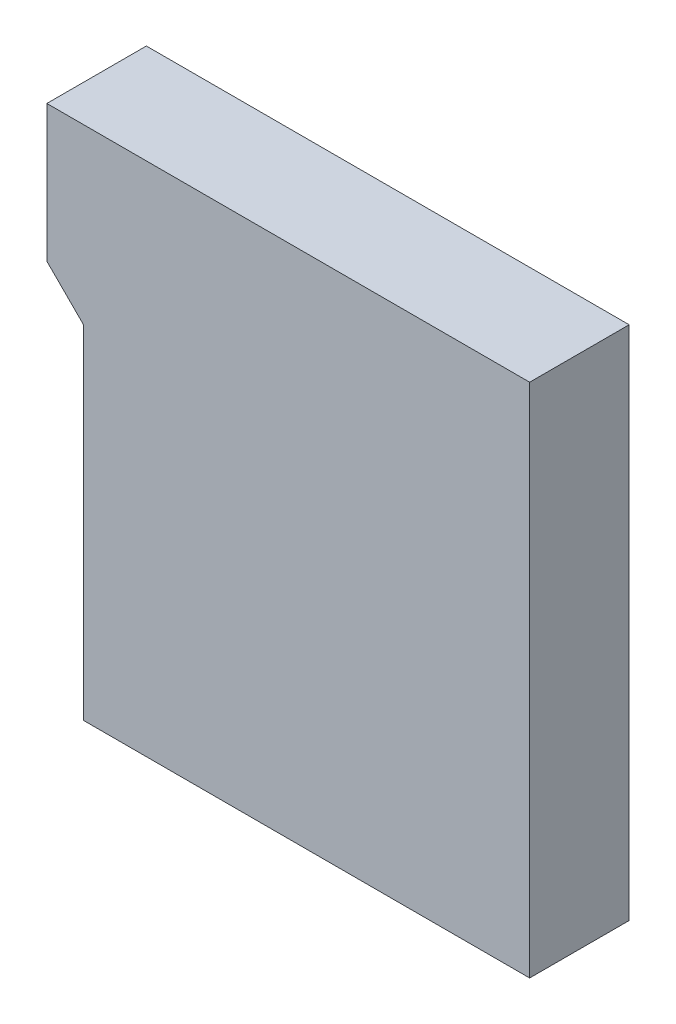
ISO-10303-21;
HEADER;
FILE_DESCRIPTION(('STEP AP214'),'2;1');
FILE_NAME('part.step','',(''),(''),'','','');
FILE_SCHEMA(('AUTOMOTIVE_DESIGN { 1 0 10303 214 1 1 1 1 }'));
ENDSEC;
DATA;
#1=APPLICATION_CONTEXT('core data for automotive mechanical design processes');
#2=APPLICATION_PROTOCOL_DEFINITION('international standard','automotive_design',2000,#1);
#3=PRODUCT_CONTEXT('',#1,'mechanical');
#4=PRODUCT('Part','Part','',(#3));
#5=PRODUCT_RELATED_PRODUCT_CATEGORY('part','',(#4));
#6=PRODUCT_DEFINITION_FORMATION('','',#4);
#7=PRODUCT_DEFINITION_CONTEXT('part definition',#1,'design');
#8=PRODUCT_DEFINITION('design','',#6,#7);
#9=PRODUCT_DEFINITION_SHAPE('','',#8);
#10=(LENGTH_UNIT() NAMED_UNIT(*) SI_UNIT(.MILLI.,.METRE.));
#11=(NAMED_UNIT(*) PLANE_ANGLE_UNIT() SI_UNIT($,.RADIAN.));
#12=(NAMED_UNIT(*) SI_UNIT($,.STERADIAN.) SOLID_ANGLE_UNIT());
#13=UNCERTAINTY_MEASURE_WITH_UNIT(LENGTH_MEASURE(1.E-05),#10,'distance_accuracy_value','');
#14=(GEOMETRIC_REPRESENTATION_CONTEXT(3) GLOBAL_UNCERTAINTY_ASSIGNED_CONTEXT((#13)) GLOBAL_UNIT_ASSIGNED_CONTEXT((#10,
#11,#12)) REPRESENTATION_CONTEXT('',''));
#15=CARTESIAN_POINT('',(0.,0.,0.));
#16=DIRECTION('',(0.,0.,1.));
#17=DIRECTION('',(1.,0.,0.));
#18=AXIS2_PLACEMENT_3D('',#15,#16,#17);
#19=CARTESIAN_POINT('',(63.3003622656408,109.843466977696,179.01));
#20=DIRECTION('',(0.999999999992343,-3.9134233953742E-06,0.));
#21=DIRECTION('',(-3.9134233953742E-06,-0.999999999992343,0.));
#22=AXIS2_PLACEMENT_3D('',#19,#20,#21);
#23=PLANE('',#22);
#24=DIRECTION('',(-3.91342339883025E-06,-0.999999999992342,0.));
#25=VECTOR('',#24,1.);
#26=CARTESIAN_POINT('',(63.3003622265066,109.833466977696,176.3));
#27=LINE('',#26,#25);
#28=CARTESIAN_POINT('',(63.3003622265066,109.833466977697,176.3));
#29=VERTEX_POINT('',#28);
#30=CARTESIAN_POINT('',(63.300307438579,95.8334669778036,176.3));
#31=VERTEX_POINT('',#30);
#32=EDGE_CURVE('E109',#29,#31,#27,.T.);
#33=ORIENTED_EDGE('',*,*,#32,.F.);
#34=DIRECTION('',(0.,0.,-1.));
#35=VECTOR('',#34,1.);
#36=CARTESIAN_POINT('',(63.3003622265066,109.833466977696,177.65));
#37=LINE('',#36,#35);
#38=CARTESIAN_POINT('',(63.3003622265066,109.833466977697,179.));
#39=VERTEX_POINT('',#38);
#40=EDGE_CURVE('E98',#39,#29,#37,.T.);
#41=ORIENTED_EDGE('',*,*,#40,.F.);
#42=DIRECTION('',(3.91342339982152E-06,0.999999999992342,0.));
#43=VECTOR('',#42,1.);
#44=CARTESIAN_POINT('',(63.300307438579,95.8334669778037,179.));
#45=LINE('',#44,#43);
#46=CARTESIAN_POINT('',(63.300307438579,95.8334669778036,179.));
#47=VERTEX_POINT('',#46);
#48=EDGE_CURVE('E115',#47,#39,#45,.T.);
#49=ORIENTED_EDGE('',*,*,#48,.F.);
#50=DIRECTION('',(0.,0.,1.));
#51=VECTOR('',#50,1.);
#52=CARTESIAN_POINT('',(63.300307438579,95.8334669778036,177.65));
#53=LINE('',#52,#51);
#54=EDGE_CURVE('E89',#31,#47,#53,.T.);
#55=ORIENTED_EDGE('',*,*,#54,.F.);
#56=EDGE_LOOP('',(#33,#41,#49,#55));
#57=FACE_BOUND('',#56,.T.);
#58=ADVANCED_FACE('F16',(#57),#23,.T.);
#59=CARTESIAN_POINT('',(50.190362226607,109.833518282677,179.01));
#60=DIRECTION('',(3.91342340054672E-06,0.999999999992343,0.));
#61=DIRECTION('',(0.999999999992343,-3.91342340054672E-06,0.));
#62=AXIS2_PLACEMENT_3D('',#59,#60,#61);
#63=PLANE('',#62);
#64=DIRECTION('',(0.999999999992343,-3.913423358695E-06,0.));
#65=VECTOR('',#64,1.);
#66=CARTESIAN_POINT('',(50.2003622266069,109.833518243543,176.3));
#67=LINE('',#66,#65);
#68=CARTESIAN_POINT('',(50.2003622266069,109.833518243543,176.3));
#69=VERTEX_POINT('',#68);
#70=EDGE_CURVE('E111',#69,#29,#67,.T.);
#71=ORIENTED_EDGE('',*,*,#70,.F.);
#72=DIRECTION('',(0.,0.,-1.));
#73=VECTOR('',#72,1.);
#74=CARTESIAN_POINT('',(50.2003622266069,109.833518243543,177.65));
#75=LINE('',#74,#73);
#76=CARTESIAN_POINT('',(50.2003622266069,109.833518243543,179.));
#77=VERTEX_POINT('',#76);
#78=EDGE_CURVE('E100',#77,#69,#75,.T.);
#79=ORIENTED_EDGE('',*,*,#78,.F.);
#80=DIRECTION('',(-0.999999999992343,3.913423358695E-06,0.));
#81=VECTOR('',#80,1.);
#82=CARTESIAN_POINT('',(63.3003622265066,109.833466977697,179.));
#83=LINE('',#82,#81);
#84=EDGE_CURVE('E114',#39,#77,#83,.T.);
#85=ORIENTED_EDGE('',*,*,#84,.F.);
#86=ORIENTED_EDGE('',*,*,#40,.T.);
#87=EDGE_LOOP('',(#71,#79,#85,#86));
#88=FACE_BOUND('',#87,.T.);
#89=ADVANCED_FACE('F121',(#88),#63,.T.);
#90=CARTESIAN_POINT('',(50.1903477191286,95.8234669778037,179.));
#91=DIRECTION('',(0.,0.,1.));
#92=DIRECTION('',(1.,0.,0.));
#93=AXIS2_PLACEMENT_3D('',#90,#91,#92);
#94=PLANE('',#93);
#95=ORIENTED_EDGE('',*,*,#48,.T.);
#96=ORIENTED_EDGE('',*,*,#84,.T.);
#97=DIRECTION('',(3.91342337665802E-06,0.999999999992343,0.));
#98=VECTOR('',#97,1.);
#99=CARTESIAN_POINT('',(50.2003549728677,107.979964852964,179.));
#100=LINE('',#99,#98);
#101=CARTESIAN_POINT('',(50.2003477191286,106.126411462385,179.));
#102=VERTEX_POINT('',#101);
#103=EDGE_CURVE('E97',#102,#77,#100,.T.);
#104=ORIENTED_EDGE('',*,*,#103,.F.);
#105=DIRECTION('',(0.7071040139728,-0.707109548389465,0.));
#106=VECTOR('',#105,1.);
#107=CARTESIAN_POINT('',(50.2003477191286,106.126411462385,179.));
#108=LINE('',#107,#106);
#109=CARTESIAN_POINT('',(51.2003438056975,105.126407548969,179.));
#110=VERTEX_POINT('',#109);
#111=EDGE_CURVE('E20',#102,#110,#108,.T.);
#112=ORIENTED_EDGE('',*,*,#111,.T.);
#113=DIRECTION('',(3.91342339665932E-06,0.999999999992343,0.));
#114=VECTOR('',#113,1.);
#115=CARTESIAN_POINT('',(51.2003256221846,100.479960939598,179.));
#116=LINE('',#115,#114);
#117=CARTESIAN_POINT('',(51.2003074386717,95.8335143327268,179.));
#118=VERTEX_POINT('',#117);
#119=EDGE_CURVE('E72',#118,#110,#116,.T.);
#120=ORIENTED_EDGE('',*,*,#119,.F.);
#121=DIRECTION('',(-0.999999999992343,3.91342340134267E-06,0.));
#122=VECTOR('',#121,1.);
#123=CARTESIAN_POINT('',(57.2503074386254,95.8334906540152,179.));
#124=LINE('',#123,#122);
#125=EDGE_CURVE('E76',#47,#118,#124,.T.);
#126=ORIENTED_EDGE('',*,*,#125,.F.);
#127=EDGE_LOOP('',(#95,#96,#104,#112,#120,#126));
#128=FACE_BOUND('',#127,.T.);
#129=ADVANCED_FACE('F75',(#128),#94,.T.);
#130=CARTESIAN_POINT('',(63.3103622265066,95.8234669778037,176.3));
#131=DIRECTION('',(0.,0.,-1.));
#132=DIRECTION('',(-1.,0.,0.));
#133=AXIS2_PLACEMENT_3D('',#130,#131,#132);
#134=PLANE('',#133);
#135=DIRECTION('',(-3.91342339665932E-06,-0.999999999992343,0.));
#136=VECTOR('',#135,1.);
#137=CARTESIAN_POINT('',(51.2003256221846,100.479960939598,176.3));
#138=LINE('',#137,#136);
#139=CARTESIAN_POINT('',(51.2003438056975,105.126407548969,176.3));
#140=VERTEX_POINT('',#139);
#141=CARTESIAN_POINT('',(51.2003074411717,95.8335143302268,176.3));
#142=VERTEX_POINT('',#141);
#143=EDGE_CURVE('E81',#140,#142,#138,.T.);
#144=ORIENTED_EDGE('',*,*,#143,.F.);
#145=DIRECTION('',(-0.707104013972795,0.70710954838947,0.));
#146=VECTOR('',#145,1.);
#147=CARTESIAN_POINT('',(51.2003438056975,105.126407548969,176.3));
#148=LINE('',#147,#146);
#149=CARTESIAN_POINT('',(50.2003477191286,106.126411462385,176.3));
#150=VERTEX_POINT('',#149);
#151=EDGE_CURVE('E34',#140,#150,#148,.T.);
#152=ORIENTED_EDGE('',*,*,#151,.T.);
#153=DIRECTION('',(-3.91342337665802E-06,-0.999999999992343,0.));
#154=VECTOR('',#153,1.);
#155=CARTESIAN_POINT('',(50.2003549728677,107.979964852964,176.3));
#156=LINE('',#155,#154);
#157=EDGE_CURVE('E82',#69,#150,#156,.T.);
#158=ORIENTED_EDGE('',*,*,#157,.F.);
#159=ORIENTED_EDGE('',*,*,#70,.T.);
#160=ORIENTED_EDGE('',*,*,#32,.T.);
#161=DIRECTION('',(0.999999999992343,-3.91342340134267E-06,0.));
#162=VECTOR('',#161,1.);
#163=CARTESIAN_POINT('',(57.2503074386254,95.8334906540152,176.3));
#164=LINE('',#163,#162);
#165=EDGE_CURVE('E69',#142,#31,#164,.T.);
#166=ORIENTED_EDGE('',*,*,#165,.F.);
#167=EDGE_LOOP('',(#144,#152,#158,#159,#160,#166));
#168=FACE_BOUND('',#167,.T.);
#169=ADVANCED_FACE('F138',(#168),#134,.T.);
#170=CARTESIAN_POINT('',(63.3103074385789,95.8334669386694,179.01));
#171=DIRECTION('',(-3.91342340134267E-06,-0.999999999992343,0.));
#172=DIRECTION('',(-0.999999999992343,3.91342340134267E-06,0.));
#173=AXIS2_PLACEMENT_3D('',#170,#171,#172);
#174=PLANE('',#173);
#175=ORIENTED_EDGE('',*,*,#165,.T.);
#176=ORIENTED_EDGE('',*,*,#54,.T.);
#177=ORIENTED_EDGE('',*,*,#125,.T.);
#178=DIRECTION('',(0.,0.,1.));
#179=VECTOR('',#178,1.);
#180=CARTESIAN_POINT('',(51.2003074386717,95.8335143302268,177.65));
#181=LINE('',#180,#179);
#182=EDGE_CURVE('E86',#142,#118,#181,.T.);
#183=ORIENTED_EDGE('',*,*,#182,.F.);
#184=EDGE_LOOP('',(#175,#176,#177,#183));
#185=FACE_BOUND('',#184,.T.);
#186=ADVANCED_FACE('F85',(#185),#174,.T.);
#187=CARTESIAN_POINT('',(50.2003476799943,106.116411462385,179.01));
#188=DIRECTION('',(-0.999999999992343,3.91342337665802E-06,0.));
#189=DIRECTION('',(3.91342337665802E-06,0.999999999992343,0.));
#190=AXIS2_PLACEMENT_3D('',#187,#188,#189);
#191=PLANE('',#190);
#192=ORIENTED_EDGE('',*,*,#157,.T.);
#193=DIRECTION('',(0.,0.,-1.));
#194=VECTOR('',#193,1.);
#195=CARTESIAN_POINT('',(50.2003477191286,106.126411462385,177.65));
#196=LINE('',#195,#194);
#197=EDGE_CURVE('E26',#102,#150,#196,.T.);
#198=ORIENTED_EDGE('',*,*,#197,.F.);
#199=ORIENTED_EDGE('',*,*,#103,.T.);
#200=ORIENTED_EDGE('',*,*,#78,.T.);
#201=EDGE_LOOP('',(#192,#198,#199,#200));
#202=FACE_BOUND('',#201,.T.);
#203=ADVANCED_FACE('F125',(#202),#191,.T.);
#204=CARTESIAN_POINT('',(51.2003073995375,95.8235143302269,179.01));
#205=DIRECTION('',(-0.999999999992343,3.91342339665932E-06,0.));
#206=DIRECTION('',(3.91342339665932E-06,0.999999999992343,0.));
#207=AXIS2_PLACEMENT_3D('',#204,#205,#206);
#208=PLANE('',#207);
#209=ORIENTED_EDGE('',*,*,#143,.T.);
#210=ORIENTED_EDGE('',*,*,#182,.T.);
#211=ORIENTED_EDGE('',*,*,#119,.T.);
#212=DIRECTION('',(0.,0.,1.));
#213=VECTOR('',#212,1.);
#214=CARTESIAN_POINT('',(51.2003438056974,105.126407548969,177.65));
#215=LINE('',#214,#213);
#216=EDGE_CURVE('E10',#140,#110,#215,.T.);
#217=ORIENTED_EDGE('',*,*,#216,.F.);
#218=EDGE_LOOP('',(#209,#210,#211,#217));
#219=FACE_BOUND('',#218,.T.);
#220=ADVANCED_FACE('F91',(#219),#208,.T.);
#221=CARTESIAN_POINT('',(51.2074148458372,105.119336453485,179.01));
#222=DIRECTION('',(-0.707109548389524,-0.707104013972742,0.));
#223=DIRECTION('',(-0.707104013972742,0.707109548389524,0.));
#224=AXIS2_PLACEMENT_3D('',#221,#222,#223);
#225=PLANE('',#224);
#226=ORIENTED_EDGE('',*,*,#151,.F.);
#227=ORIENTED_EDGE('',*,*,#216,.T.);
#228=ORIENTED_EDGE('',*,*,#111,.F.);
#229=ORIENTED_EDGE('',*,*,#197,.T.);
#230=EDGE_LOOP('',(#226,#227,#228,#229));
#231=FACE_BOUND('',#230,.T.);
#232=ADVANCED_FACE('F18',(#231),#225,.T.);
#233=CLOSED_SHELL('',(#58,#89,#129,#169,#186,#203,#220,#232));
#234=MANIFOLD_SOLID_BREP('B1',#233);
#235=ADVANCED_BREP_SHAPE_REPRESENTATION('',(#18,#234),#14);
#236=SHAPE_DEFINITION_REPRESENTATION(#9,#235);
ENDSEC;
END-ISO-10303-21;
